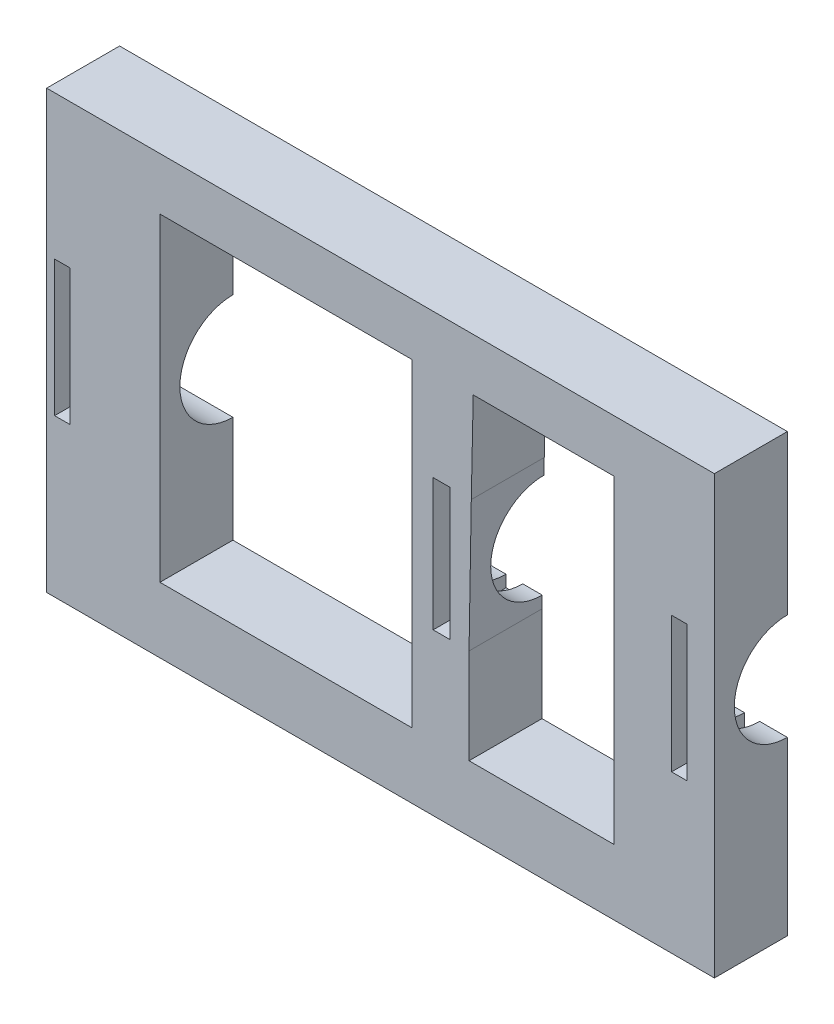
ISO-10303-21;
HEADER;
FILE_DESCRIPTION(('STEP AP214'),'2;1');
FILE_NAME('part.step','',(''),(''),'','','');
FILE_SCHEMA(('AUTOMOTIVE_DESIGN { 1 0 10303 214 1 1 1 1 }'));
ENDSEC;
DATA;
#1=APPLICATION_CONTEXT('core data for automotive mechanical design processes');
#2=APPLICATION_PROTOCOL_DEFINITION('international standard','automotive_design',2000,#1);
#3=PRODUCT_CONTEXT('',#1,'mechanical');
#4=PRODUCT('Part','Part','',(#3));
#5=PRODUCT_RELATED_PRODUCT_CATEGORY('part','',(#4));
#6=PRODUCT_DEFINITION_FORMATION('','',#4);
#7=PRODUCT_DEFINITION_CONTEXT('part definition',#1,'design');
#8=PRODUCT_DEFINITION('design','',#6,#7);
#9=PRODUCT_DEFINITION_SHAPE('','',#8);
#10=(LENGTH_UNIT() NAMED_UNIT(*) SI_UNIT(.MILLI.,.METRE.));
#11=(NAMED_UNIT(*) PLANE_ANGLE_UNIT() SI_UNIT($,.RADIAN.));
#12=(NAMED_UNIT(*) SI_UNIT($,.STERADIAN.) SOLID_ANGLE_UNIT());
#13=UNCERTAINTY_MEASURE_WITH_UNIT(LENGTH_MEASURE(1.E-05),#10,'distance_accuracy_value','');
#14=(GEOMETRIC_REPRESENTATION_CONTEXT(3) GLOBAL_UNCERTAINTY_ASSIGNED_CONTEXT((#13)) GLOBAL_UNIT_ASSIGNED_CONTEXT((#10,
#11,#12)) REPRESENTATION_CONTEXT('',''));
#15=CARTESIAN_POINT('',(0.,0.,0.));
#16=DIRECTION('',(0.,0.,1.));
#17=DIRECTION('',(1.,0.,0.));
#18=AXIS2_PLACEMENT_3D('',#15,#16,#17);
#19=CARTESIAN_POINT('',(0.,22.0472,0.));
#20=DIRECTION('',(0.,1.,0.));
#21=DIRECTION('',(0.,0.,1.));
#22=AXIS2_PLACEMENT_3D('',#19,#20,#21);
#23=PLANE('',#22);
#24=DIRECTION('',(1.,0.,0.));
#25=VECTOR('',#24,1.);
#26=CARTESIAN_POINT('',(0.,22.0472,-10.0297121690447));
#27=LINE('',#26,#25);
#28=CARTESIAN_POINT('',(10.9894216317088,22.0472,-10.0297121690447));
#29=VERTEX_POINT('',#28);
#30=CARTESIAN_POINT('',(35.4588719569476,22.0472,-10.0297121690446));
#31=VERTEX_POINT('',#30);
#32=EDGE_CURVE('E472',#29,#31,#27,.T.);
#33=ORIENTED_EDGE('',*,*,#32,.F.);
#34=DIRECTION('',(0.,0.,-1.));
#35=VECTOR('',#34,1.);
#36=CARTESIAN_POINT('',(10.9894216317088,22.0472,0.));
#37=LINE('',#36,#35);
#38=CARTESIAN_POINT('',(10.9894216317088,22.0472,-17.1069));
#39=VERTEX_POINT('',#38);
#40=EDGE_CURVE('E554',#29,#39,#37,.T.);
#41=ORIENTED_EDGE('',*,*,#40,.T.);
#42=DIRECTION('',(-1.,0.,0.));
#43=VECTOR('',#42,1.);
#44=CARTESIAN_POINT('',(66.04,22.0472,-17.1069));
#45=LINE('',#44,#43);
#46=CARTESIAN_POINT('',(35.4588719569476,22.0472,-17.1069));
#47=VERTEX_POINT('',#46);
#48=EDGE_CURVE('E538',#47,#39,#45,.T.);
#49=ORIENTED_EDGE('',*,*,#48,.F.);
#50=DIRECTION('',(0.,0.,-1.));
#51=VECTOR('',#50,1.);
#52=CARTESIAN_POINT('',(35.4588719569476,22.0472,1.9431));
#53=LINE('',#52,#51);
#54=EDGE_CURVE('E374',#31,#47,#53,.T.);
#55=ORIENTED_EDGE('',*,*,#54,.F.);
#56=EDGE_LOOP('',(#33,#41,#49,#55));
#57=FACE_BOUND('',#56,.T.);
#58=ADVANCED_FACE('F37',(#57),#23,.F.);
#59=CARTESIAN_POINT('',(0.,-8.89,0.));
#60=DIRECTION('',(0.,-1.,0.));
#61=DIRECTION('',(0.,0.,-1.));
#62=AXIS2_PLACEMENT_3D('',#59,#60,#61);
#63=PLANE('',#62);
#64=DIRECTION('',(-1.,0.,0.));
#65=VECTOR('',#64,1.);
#66=CARTESIAN_POINT('',(0.,-8.89,-10.0297121690447));
#67=LINE('',#66,#65);
#68=CARTESIAN_POINT('',(35.4588719569476,-8.89,-10.0297121690447));
#69=VERTEX_POINT('',#68);
#70=CARTESIAN_POINT('',(10.9894216317088,-8.89,-10.0297121690447));
#71=VERTEX_POINT('',#70);
#72=EDGE_CURVE('E475',#69,#71,#67,.T.);
#73=ORIENTED_EDGE('',*,*,#72,.F.);
#74=DIRECTION('',(0.,0.,-1.));
#75=VECTOR('',#74,1.);
#76=CARTESIAN_POINT('',(35.4588719569476,-8.89,0.));
#77=LINE('',#76,#75);
#78=CARTESIAN_POINT('',(35.4588719569476,-8.89,-17.1069));
#79=VERTEX_POINT('',#78);
#80=EDGE_CURVE('E528',#69,#79,#77,.T.);
#81=ORIENTED_EDGE('',*,*,#80,.T.);
#82=DIRECTION('',(1.,0.,0.));
#83=VECTOR('',#82,1.);
#84=CARTESIAN_POINT('',(66.04,-8.89,-17.1069));
#85=LINE('',#84,#83);
#86=CARTESIAN_POINT('',(10.9894216317088,-8.89,-17.1069));
#87=VERTEX_POINT('',#86);
#88=EDGE_CURVE('E349',#87,#79,#85,.T.);
#89=ORIENTED_EDGE('',*,*,#88,.F.);
#90=DIRECTION('',(0.,0.,1.));
#91=VECTOR('',#90,1.);
#92=CARTESIAN_POINT('',(10.9894216317088,-8.89,0.));
#93=LINE('',#92,#91);
#94=EDGE_CURVE('E326',#87,#71,#93,.T.);
#95=ORIENTED_EDGE('',*,*,#94,.T.);
#96=EDGE_LOOP('',(#73,#81,#89,#95));
#97=FACE_BOUND('',#96,.T.);
#98=ADVANCED_FACE('F550',(#97),#63,.F.);
#99=CARTESIAN_POINT('',(62.0901605244133,13.1572,-3.21005743926288));
#100=DIRECTION('',(1.,0.,0.));
#101=DIRECTION('',(0.,0.,-1.));
#102=AXIS2_PLACEMENT_3D('',#99,#100,#101);
#103=PLANE('',#102);
#104=DIRECTION('',(0.,-1.,0.));
#105=VECTOR('',#104,1.);
#106=CARTESIAN_POINT('',(62.0901605244133,13.1572,-10.0297121690447));
#107=LINE('',#106,#105);
#108=CARTESIAN_POINT('',(62.0901605244133,13.1572,-10.0297121690447));
#109=VERTEX_POINT('',#108);
#110=CARTESIAN_POINT('',(62.0901605244133,0.,-10.0297121690447));
#111=VERTEX_POINT('',#110);
#112=EDGE_CURVE('E47',#109,#111,#107,.T.);
#113=ORIENTED_EDGE('',*,*,#112,.F.);
#114=DIRECTION('',(0.,0.,1.));
#115=VECTOR('',#114,1.);
#116=CARTESIAN_POINT('',(62.0901605244133,13.1572,-3.21005743926288));
#117=LINE('',#116,#115);
#118=CARTESIAN_POINT('',(62.0901605244133,13.1572,-17.1069));
#119=VERTEX_POINT('',#118);
#120=EDGE_CURVE('E305',#119,#109,#117,.T.);
#121=ORIENTED_EDGE('',*,*,#120,.F.);
#122=DIRECTION('',(0.,-1.,0.));
#123=VECTOR('',#122,1.);
#124=CARTESIAN_POINT('',(62.0901605244133,13.1572,-17.1069));
#125=LINE('',#124,#123);
#126=CARTESIAN_POINT('',(62.0901605244133,11.7221,-17.1069));
#127=VERTEX_POINT('',#126);
#128=EDGE_CURVE('E343',#119,#127,#125,.T.);
#129=ORIENTED_EDGE('',*,*,#128,.T.);
#130=CARTESIAN_POINT('',(62.0901605244133,6.5786,-17.1069));
#131=DIRECTION('',(1.,0.,0.));
#132=DIRECTION('',(0.,0.,-1.));
#133=AXIS2_PLACEMENT_3D('',#130,#131,#132);
#134=CIRCLE('',#133,5.1435);
#135=CARTESIAN_POINT('',(62.0901605244133,1.4351,-17.1069));
#136=VERTEX_POINT('',#135);
#137=EDGE_CURVE('E339',#127,#136,#134,.T.);
#138=ORIENTED_EDGE('',*,*,#137,.T.);
#139=CARTESIAN_POINT('',(62.0901605244133,0.,-17.1069));
#140=VERTEX_POINT('',#139);
#141=EDGE_CURVE('E342',#136,#140,#125,.T.);
#142=ORIENTED_EDGE('',*,*,#141,.T.);
#143=DIRECTION('',(0.,0.,1.));
#144=VECTOR('',#143,1.);
#145=CARTESIAN_POINT('',(62.0901605244133,0.,-3.21005743926288));
#146=LINE('',#145,#144);
#147=EDGE_CURVE('E609',#140,#111,#146,.T.);
#148=ORIENTED_EDGE('',*,*,#147,.T.);
#149=EDGE_LOOP('',(#113,#121,#129,#138,#142,#148));
#150=FACE_BOUND('',#149,.T.);
#151=ADVANCED_FACE('F652',(#150),#103,.F.);
#152=CARTESIAN_POINT('',(60.6169605244134,13.1572,-3.21005743926288));
#153=DIRECTION('',(-1.,0.,0.));
#154=DIRECTION('',(0.,0.,1.));
#155=AXIS2_PLACEMENT_3D('',#152,#153,#154);
#156=PLANE('',#155);
#157=DIRECTION('',(0.,1.,0.));
#158=VECTOR('',#157,1.);
#159=CARTESIAN_POINT('',(60.6169605244134,13.1572,-10.0297121690447));
#160=LINE('',#159,#158);
#161=CARTESIAN_POINT('',(60.6169605244134,0.,-10.0297121690447));
#162=VERTEX_POINT('',#161);
#163=CARTESIAN_POINT('',(60.6169605244134,13.1572,-10.0297121690447));
#164=VERTEX_POINT('',#163);
#165=EDGE_CURVE('E11',#162,#164,#160,.T.);
#166=ORIENTED_EDGE('',*,*,#165,.F.);
#167=DIRECTION('',(0.,0.,-1.));
#168=VECTOR('',#167,1.);
#169=CARTESIAN_POINT('',(60.6169605244134,0.,-3.21005743926288));
#170=LINE('',#169,#168);
#171=CARTESIAN_POINT('',(60.6169605244134,0.,-17.1069));
#172=VERTEX_POINT('',#171);
#173=EDGE_CURVE('E331',#162,#172,#170,.T.);
#174=ORIENTED_EDGE('',*,*,#173,.T.);
#175=DIRECTION('',(0.,-1.,0.));
#176=VECTOR('',#175,1.);
#177=CARTESIAN_POINT('',(60.6169605244134,13.1572,-17.1069));
#178=LINE('',#177,#176);
#179=CARTESIAN_POINT('',(60.6169605244134,1.4351,-17.1069));
#180=VERTEX_POINT('',#179);
#181=EDGE_CURVE('E518',#180,#172,#178,.T.);
#182=ORIENTED_EDGE('',*,*,#181,.F.);
#183=CARTESIAN_POINT('',(60.6169605244134,6.5786,-17.1069));
#184=DIRECTION('',(-1.,0.,0.));
#185=DIRECTION('',(0.,0.,1.));
#186=AXIS2_PLACEMENT_3D('',#183,#184,#185);
#187=CIRCLE('',#186,5.1435);
#188=CARTESIAN_POINT('',(60.6169605244134,11.7221,-17.1069));
#189=VERTEX_POINT('',#188);
#190=EDGE_CURVE('E328',#180,#189,#187,.T.);
#191=ORIENTED_EDGE('',*,*,#190,.T.);
#192=CARTESIAN_POINT('',(60.6169605244134,13.1572,-17.1069));
#193=VERTEX_POINT('',#192);
#194=EDGE_CURVE('E533',#193,#189,#178,.T.);
#195=ORIENTED_EDGE('',*,*,#194,.F.);
#196=DIRECTION('',(0.,0.,-1.));
#197=VECTOR('',#196,1.);
#198=CARTESIAN_POINT('',(60.6169605244134,13.1572,-3.21005743926288));
#199=LINE('',#198,#197);
#200=EDGE_CURVE('E302',#164,#193,#199,.T.);
#201=ORIENTED_EDGE('',*,*,#200,.F.);
#202=EDGE_LOOP('',(#166,#174,#182,#191,#195,#201));
#203=FACE_BOUND('',#202,.T.);
#204=ADVANCED_FACE('F646',(#203),#156,.F.);
#205=CARTESIAN_POINT('',(55.0505783682912,13.1572,-3.21005743926288));
#206=DIRECTION('',(1.,0.,0.));
#207=DIRECTION('',(0.,0.,-1.));
#208=AXIS2_PLACEMENT_3D('',#205,#206,#207);
#209=PLANE('',#208);
#210=DIRECTION('',(0.,-1.,0.));
#211=VECTOR('',#210,1.);
#212=CARTESIAN_POINT('',(55.0505783682912,13.1572,-10.0297121690447));
#213=LINE('',#212,#211);
#214=CARTESIAN_POINT('',(55.0505783682912,22.0472,-10.0297121690447));
#215=VERTEX_POINT('',#214);
#216=CARTESIAN_POINT('',(55.0505783682912,-8.89,-10.0297121690447));
#217=VERTEX_POINT('',#216);
#218=EDGE_CURVE('E482',#215,#217,#213,.T.);
#219=ORIENTED_EDGE('',*,*,#218,.F.);
#220=DIRECTION('',(0.,0.,1.));
#221=VECTOR('',#220,1.);
#222=CARTESIAN_POINT('',(55.0505783682912,22.0472,-17.1069));
#223=LINE('',#222,#221);
#224=CARTESIAN_POINT('',(55.0505783682912,22.0472,-17.1069));
#225=VERTEX_POINT('',#224);
#226=EDGE_CURVE('E509',#225,#215,#223,.T.);
#227=ORIENTED_EDGE('',*,*,#226,.F.);
#228=DIRECTION('',(0.,-1.,0.));
#229=VECTOR('',#228,1.);
#230=CARTESIAN_POINT('',(55.0505783682912,13.1572,-17.1069));
#231=LINE('',#230,#229);
#232=CARTESIAN_POINT('',(55.0505783682912,11.7221,-17.1069));
#233=VERTEX_POINT('',#232);
#234=EDGE_CURVE('E323',#225,#233,#231,.T.);
#235=ORIENTED_EDGE('',*,*,#234,.T.);
#236=CARTESIAN_POINT('',(55.0505783682912,6.5786,-17.1069));
#237=DIRECTION('',(1.,0.,0.));
#238=DIRECTION('',(0.,0.,-1.));
#239=AXIS2_PLACEMENT_3D('',#236,#237,#238);
#240=CIRCLE('',#239,5.1435);
#241=CARTESIAN_POINT('',(55.0505783682912,1.4351,-17.1069));
#242=VERTEX_POINT('',#241);
#243=EDGE_CURVE('E321',#233,#242,#240,.T.);
#244=ORIENTED_EDGE('',*,*,#243,.T.);
#245=CARTESIAN_POINT('',(55.0505783682912,-8.89,-17.1069));
#246=VERTEX_POINT('',#245);
#247=EDGE_CURVE('E314',#242,#246,#231,.T.);
#248=ORIENTED_EDGE('',*,*,#247,.T.);
#249=DIRECTION('',(0.,0.,-1.));
#250=VECTOR('',#249,1.);
#251=CARTESIAN_POINT('',(55.0505783682912,-8.89,-17.1069));
#252=LINE('',#251,#250);
#253=EDGE_CURVE('E460',#217,#246,#252,.T.);
#254=ORIENTED_EDGE('',*,*,#253,.F.);
#255=EDGE_LOOP('',(#219,#227,#235,#244,#248,#254));
#256=FACE_BOUND('',#255,.T.);
#257=ADVANCED_FACE('F641',(#256),#209,.F.);
#258=CARTESIAN_POINT('',(10.9894216317088,13.1572,-17.1069));
#259=DIRECTION('',(-1.,0.,0.));
#260=DIRECTION('',(0.,0.,1.));
#261=AXIS2_PLACEMENT_3D('',#258,#259,#260);
#262=PLANE('',#261);
#263=DIRECTION('',(0.,1.,0.));
#264=VECTOR('',#263,1.);
#265=CARTESIAN_POINT('',(10.9894216317088,13.1572,-10.0297121690447));
#266=LINE('',#265,#264);
#267=EDGE_CURVE('E420',#71,#29,#266,.T.);
#268=ORIENTED_EDGE('',*,*,#267,.F.);
#269=ORIENTED_EDGE('',*,*,#94,.F.);
#270=DIRECTION('',(0.,-1.,0.));
#271=VECTOR('',#270,1.);
#272=CARTESIAN_POINT('',(10.9894216317088,13.1572,-17.1069));
#273=LINE('',#272,#271);
#274=CARTESIAN_POINT('',(10.9894216317088,1.4351,-17.1069));
#275=VERTEX_POINT('',#274);
#276=EDGE_CURVE('E353',#275,#87,#273,.T.);
#277=ORIENTED_EDGE('',*,*,#276,.F.);
#278=CARTESIAN_POINT('',(10.9894216317088,6.5786,-17.1069));
#279=DIRECTION('',(-1.,0.,0.));
#280=DIRECTION('',(0.,0.,1.));
#281=AXIS2_PLACEMENT_3D('',#278,#279,#280);
#282=CIRCLE('',#281,5.1435);
#283=CARTESIAN_POINT('',(10.9894216317088,11.7221,-17.1069));
#284=VERTEX_POINT('',#283);
#285=EDGE_CURVE('E310',#275,#284,#282,.T.);
#286=ORIENTED_EDGE('',*,*,#285,.T.);
#287=EDGE_CURVE('E536',#39,#284,#273,.T.);
#288=ORIENTED_EDGE('',*,*,#287,.F.);
#289=ORIENTED_EDGE('',*,*,#40,.F.);
#290=EDGE_LOOP('',(#268,#269,#277,#286,#288,#289));
#291=FACE_BOUND('',#290,.T.);
#292=ADVANCED_FACE('F546',(#291),#262,.F.);
#293=CARTESIAN_POINT('',(0.,13.1572,-17.1069));
#294=DIRECTION('',(1.,0.,0.));
#295=DIRECTION('',(0.,0.,-1.));
#296=AXIS2_PLACEMENT_3D('',#293,#294,#295);
#297=PLANE('',#296);
#298=DIRECTION('',(0.,-1.,0.));
#299=VECTOR('',#298,1.);
#300=CARTESIAN_POINT('',(0.,27.1272,-10.0297121690447));
#301=LINE('',#300,#299);
#302=CARTESIAN_POINT('',(0.,27.1272,-10.0297121690447));
#303=VERTEX_POINT('',#302);
#304=CARTESIAN_POINT('',(0.,-15.24,-10.0297121690447));
#305=VERTEX_POINT('',#304);
#306=EDGE_CURVE('E41',#303,#305,#301,.T.);
#307=ORIENTED_EDGE('',*,*,#306,.F.);
#308=DIRECTION('',(0.,0.,1.));
#309=VECTOR('',#308,1.);
#310=CARTESIAN_POINT('',(0.,27.1272,-17.1069));
#311=LINE('',#310,#309);
#312=CARTESIAN_POINT('',(0.,27.1272,-17.1069));
#313=VERTEX_POINT('',#312);
#314=EDGE_CURVE('E506',#313,#303,#311,.T.);
#315=ORIENTED_EDGE('',*,*,#314,.F.);
#316=DIRECTION('',(0.,-1.,0.));
#317=VECTOR('',#316,1.);
#318=CARTESIAN_POINT('',(0.,13.1572,-17.1069));
#319=LINE('',#318,#317);
#320=CARTESIAN_POINT('',(0.,11.7221,-17.1069));
#321=VERTEX_POINT('',#320);
#322=EDGE_CURVE('E304',#313,#321,#319,.T.);
#323=ORIENTED_EDGE('',*,*,#322,.T.);
#324=CARTESIAN_POINT('',(0.,6.5786,-17.1069));
#325=DIRECTION('',(1.,0.,0.));
#326=DIRECTION('',(0.,0.,-1.));
#327=AXIS2_PLACEMENT_3D('',#324,#325,#326);
#328=CIRCLE('',#327,5.1435);
#329=CARTESIAN_POINT('',(0.,1.4351,-17.1069));
#330=VERTEX_POINT('',#329);
#331=EDGE_CURVE('E301',#321,#330,#328,.T.);
#332=ORIENTED_EDGE('',*,*,#331,.T.);
#333=CARTESIAN_POINT('',(0.,-15.24,-17.1069));
#334=VERTEX_POINT('',#333);
#335=EDGE_CURVE('E292',#330,#334,#319,.T.);
#336=ORIENTED_EDGE('',*,*,#335,.T.);
#337=DIRECTION('',(0.,0.,-1.));
#338=VECTOR('',#337,1.);
#339=CARTESIAN_POINT('',(0.,-15.24,3.17828783095535));
#340=LINE('',#339,#338);
#341=EDGE_CURVE('E276',#305,#334,#340,.T.);
#342=ORIENTED_EDGE('',*,*,#341,.F.);
#343=EDGE_LOOP('',(#307,#315,#323,#332,#336,#342));
#344=FACE_BOUND('',#343,.T.);
#345=ADVANCED_FACE('F298',(#344),#297,.F.);
#346=CARTESIAN_POINT('',(0.,13.1572,0.));
#347=DIRECTION('',(0.,1.,0.));
#348=DIRECTION('',(0.,0.,1.));
#349=AXIS2_PLACEMENT_3D('',#346,#347,#348);
#350=PLANE('',#349);
#351=DIRECTION('',(1.,0.,0.));
#352=VECTOR('',#351,1.);
#353=CARTESIAN_POINT('',(0.,13.1572,-10.0297121690447));
#354=LINE('',#353,#352);
#355=EDGE_CURVE('E452',#164,#109,#354,.T.);
#356=ORIENTED_EDGE('',*,*,#355,.F.);
#357=ORIENTED_EDGE('',*,*,#200,.T.);
#358=DIRECTION('',(-1.,0.,0.));
#359=VECTOR('',#358,1.);
#360=CARTESIAN_POINT('',(66.04,13.1572,-17.1069));
#361=LINE('',#360,#359);
#362=EDGE_CURVE('E336',#119,#193,#361,.T.);
#363=ORIENTED_EDGE('',*,*,#362,.F.);
#364=ORIENTED_EDGE('',*,*,#120,.T.);
#365=EDGE_LOOP('',(#356,#357,#363,#364));
#366=FACE_BOUND('',#365,.T.);
#367=ADVANCED_FACE('F651',(#366),#350,.F.);
#368=DIRECTION('',(1.,0.,0.));
#369=VECTOR('',#368,1.);
#370=CARTESIAN_POINT('',(0.,22.0472,-10.0297121690447));
#371=LINE('',#370,#369);
#372=CARTESIAN_POINT('',(41.3758963344435,22.0472,-10.0297121690447));
#373=VERTEX_POINT('',#372);
#374=EDGE_CURVE('E480',#373,#215,#371,.T.);
#375=ORIENTED_EDGE('',*,*,#374,.F.);
#376=DIRECTION('',(0.,0.,-1.));
#377=VECTOR('',#376,1.);
#378=CARTESIAN_POINT('',(41.3758963344435,22.0472,0.));
#379=LINE('',#378,#377);
#380=CARTESIAN_POINT('',(41.3758963344435,22.0472,-17.1069));
#381=VERTEX_POINT('',#380);
#382=EDGE_CURVE('E513',#373,#381,#379,.T.);
#383=ORIENTED_EDGE('',*,*,#382,.T.);
#384=EDGE_CURVE('E391',#225,#381,#45,.T.);
#385=ORIENTED_EDGE('',*,*,#384,.F.);
#386=ORIENTED_EDGE('',*,*,#226,.T.);
#387=EDGE_LOOP('',(#375,#383,#385,#386));
#388=FACE_BOUND('',#387,.T.);
#389=ADVANCED_FACE('F635',(#388),#23,.F.);
#390=CARTESIAN_POINT('',(0.,27.1272,0.));
#391=DIRECTION('',(0.,1.,0.));
#392=DIRECTION('',(0.,0.,1.));
#393=AXIS2_PLACEMENT_3D('',#390,#391,#392);
#394=PLANE('',#393);
#395=ORIENTED_EDGE('',*,*,#314,.T.);
#396=DIRECTION('',(-1.,0.,0.));
#397=VECTOR('',#396,1.);
#398=CARTESIAN_POINT('',(0.,27.1272,-10.0297121690447));
#399=LINE('',#398,#397);
#400=CARTESIAN_POINT('',(64.77,27.1272,-10.0297121690447));
#401=VERTEX_POINT('',#400);
#402=EDGE_CURVE('E483',#401,#303,#399,.T.);
#403=ORIENTED_EDGE('',*,*,#402,.F.);
#404=DIRECTION('',(0.,0.,1.));
#405=VECTOR('',#404,1.);
#406=CARTESIAN_POINT('',(64.77,27.1272,-17.1069));
#407=LINE('',#406,#405);
#408=CARTESIAN_POINT('',(64.77,27.1272,-17.1069));
#409=VERTEX_POINT('',#408);
#410=EDGE_CURVE('E427',#409,#401,#407,.T.);
#411=ORIENTED_EDGE('',*,*,#410,.F.);
#412=DIRECTION('',(-1.,0.,0.));
#413=VECTOR('',#412,1.);
#414=CARTESIAN_POINT('',(66.04,27.1272,-17.1069));
#415=LINE('',#414,#413);
#416=EDGE_CURVE('E461',#409,#313,#415,.T.);
#417=ORIENTED_EDGE('',*,*,#416,.T.);
#418=EDGE_LOOP('',(#395,#403,#411,#417));
#419=FACE_BOUND('',#418,.T.);
#420=ADVANCED_FACE('F507',(#419),#394,.T.);
#421=CARTESIAN_POINT('',(0.,0.,0.));
#422=DIRECTION('',(0.,1.,0.));
#423=DIRECTION('',(0.,0.,1.));
#424=AXIS2_PLACEMENT_3D('',#421,#422,#423);
#425=PLANE('',#424);
#426=ORIENTED_EDGE('',*,*,#173,.F.);
#427=DIRECTION('',(1.,0.,0.));
#428=VECTOR('',#427,1.);
#429=CARTESIAN_POINT('',(0.,0.,-10.0297121690447));
#430=LINE('',#429,#428);
#431=EDGE_CURVE('E457',#162,#111,#430,.T.);
#432=ORIENTED_EDGE('',*,*,#431,.T.);
#433=ORIENTED_EDGE('',*,*,#147,.F.);
#434=DIRECTION('',(1.,0.,0.));
#435=VECTOR('',#434,1.);
#436=CARTESIAN_POINT('',(66.04,0.,-17.1069));
#437=LINE('',#436,#435);
#438=EDGE_CURVE('E347',#172,#140,#437,.T.);
#439=ORIENTED_EDGE('',*,*,#438,.F.);
#440=EDGE_LOOP('',(#426,#432,#433,#439));
#441=FACE_BOUND('',#440,.T.);
#442=ADVANCED_FACE('F607',(#441),#425,.T.);
#443=DIRECTION('',(-1.,0.,0.));
#444=VECTOR('',#443,1.);
#445=CARTESIAN_POINT('',(0.,-8.89,-10.0297121690447));
#446=LINE('',#445,#444);
#447=CARTESIAN_POINT('',(40.9712498169064,-8.89,-10.0297121690447));
#448=VERTEX_POINT('',#447);
#449=EDGE_CURVE('E454',#217,#448,#446,.T.);
#450=ORIENTED_EDGE('',*,*,#449,.F.);
#451=ORIENTED_EDGE('',*,*,#253,.T.);
#452=CARTESIAN_POINT('',(40.9712498169064,-8.89,-17.1069));
#453=VERTEX_POINT('',#452);
#454=EDGE_CURVE('E354',#453,#246,#85,.T.);
#455=ORIENTED_EDGE('',*,*,#454,.F.);
#456=DIRECTION('',(0.,0.,1.));
#457=VECTOR('',#456,1.);
#458=CARTESIAN_POINT('',(40.9712498169064,-8.89,0.));
#459=LINE('',#458,#457);
#460=EDGE_CURVE('E464',#453,#448,#459,.T.);
#461=ORIENTED_EDGE('',*,*,#460,.T.);
#462=EDGE_LOOP('',(#450,#451,#455,#461));
#463=FACE_BOUND('',#462,.T.);
#464=ADVANCED_FACE('F596',(#463),#63,.F.);
#465=CARTESIAN_POINT('',(0.,0.365369571658807,1.9431));
#466=DIRECTION('',(0.,1.,0.));
#467=DIRECTION('',(0.,0.,1.));
#468=AXIS2_PLACEMENT_3D('',#465,#466,#467);
#469=PLANE('',#468);
#470=DIRECTION('',(0.,0.,-1.));
#471=VECTOR('',#470,1.);
#472=CARTESIAN_POINT('',(37.4908719569476,0.365369571658807,1.9431));
#473=LINE('',#472,#471);
#474=CARTESIAN_POINT('',(37.4908719569476,0.365369571658807,-10.0297121690447));
#475=VERTEX_POINT('',#474);
#476=CARTESIAN_POINT('',(37.4908719569476,0.365369571658807,-17.1069));
#477=VERTEX_POINT('',#476);
#478=EDGE_CURVE('E355',#475,#477,#473,.T.);
#479=ORIENTED_EDGE('',*,*,#478,.F.);
#480=DIRECTION('',(1.,0.,0.));
#481=VECTOR('',#480,1.);
#482=CARTESIAN_POINT('',(0.,0.365369571658807,-10.0297121690447));
#483=LINE('',#482,#481);
#484=CARTESIAN_POINT('',(39.106263289872,0.365369571658807,-10.0297121690447));
#485=VERTEX_POINT('',#484);
#486=EDGE_CURVE('E362',#475,#485,#483,.T.);
#487=ORIENTED_EDGE('',*,*,#486,.T.);
#488=DIRECTION('',(0.,0.,-1.));
#489=VECTOR('',#488,1.);
#490=CARTESIAN_POINT('',(39.106263289872,0.365369571658807,1.9431));
#491=LINE('',#490,#489);
#492=CARTESIAN_POINT('',(39.106263289872,0.365369571658807,-17.1069));
#493=VERTEX_POINT('',#492);
#494=EDGE_CURVE('E359',#485,#493,#491,.T.);
#495=ORIENTED_EDGE('',*,*,#494,.T.);
#496=DIRECTION('',(1.,0.,0.));
#497=VECTOR('',#496,1.);
#498=CARTESIAN_POINT('',(0.,0.365369571658807,-17.1069));
#499=LINE('',#498,#497);
#500=EDGE_CURVE('E401',#477,#493,#499,.T.);
#501=ORIENTED_EDGE('',*,*,#500,.F.);
#502=EDGE_LOOP('',(#479,#487,#495,#501));
#503=FACE_BOUND('',#502,.T.);
#504=ADVANCED_FACE('F571',(#503),#469,.T.);
#505=CARTESIAN_POINT('',(40.9537664668092,-0.695619484047465,1.9431));
#506=DIRECTION('',(0.999855777897971,-0.0169830328281757,0.));
#507=DIRECTION('',(0.0169830328281757,0.999855777897971,0.));
#508=AXIS2_PLACEMENT_3D('',#505,#506,#507);
#509=PLANE('',#508);
#510=DIRECTION('',(0.,0.,-1.));
#511=VECTOR('',#510,1.);
#512=CARTESIAN_POINT('',(41.189063289872,13.1572,1.9431));
#513=LINE('',#512,#511);
#514=CARTESIAN_POINT('',(41.189063289872,13.1572,-10.0297121690447));
#515=VERTEX_POINT('',#514);
#516=CARTESIAN_POINT('',(41.189063289872,13.1572,-17.1069));
#517=VERTEX_POINT('',#516);
#518=EDGE_CURVE('E369',#515,#517,#513,.T.);
#519=ORIENTED_EDGE('',*,*,#518,.F.);
#520=DIRECTION('',(-0.0169830328281757,-0.999855777897971,0.));
#521=VECTOR('',#520,1.);
#522=CARTESIAN_POINT('',(40.9537664668092,-0.695619484047465,-10.0297121690447));
#523=LINE('',#522,#521);
#524=CARTESIAN_POINT('',(40.9712498169064,0.333691875622167,-10.0297121690447));
#525=VERTEX_POINT('',#524);
#526=EDGE_CURVE('E361',#515,#525,#523,.T.);
#527=ORIENTED_EDGE('',*,*,#526,.T.);
#528=DIRECTION('',(0.,0.,-1.));
#529=VECTOR('',#528,1.);
#530=CARTESIAN_POINT('',(40.9712498169064,0.333691875622167,1.9431));
#531=LINE('',#530,#529);
#532=CARTESIAN_POINT('',(40.9712498169064,0.333691875622167,-17.1069));
#533=VERTEX_POINT('',#532);
#534=EDGE_CURVE('E372',#525,#533,#531,.T.);
#535=ORIENTED_EDGE('',*,*,#534,.T.);
#536=DIRECTION('',(-0.0169830328281757,-0.999855777897971,0.));
#537=VECTOR('',#536,1.);
#538=CARTESIAN_POINT('',(40.9537664668092,-0.695619484047465,-17.1069));
#539=LINE('',#538,#537);
#540=CARTESIAN_POINT('',(40.9910363434789,1.4986,-17.1069));
#541=VERTEX_POINT('',#540);
#542=EDGE_CURVE('E383',#541,#533,#539,.T.);
#543=ORIENTED_EDGE('',*,*,#542,.F.);
#544=CARTESIAN_POINT('',(41.0773225946306,6.5786,-17.1069));
#545=DIRECTION('',(0.999855777897971,-0.0169830328281757,0.));
#546=DIRECTION('',(-0.0169830328281757,-0.999855777897971,0.));
#547=AXIS2_PLACEMENT_3D('',#544,#545,#546);
#548=ELLIPSE('',#547,5.08073275395762,5.08);
#549=CARTESIAN_POINT('',(41.1636088457822,11.6586,-17.1069));
#550=VERTEX_POINT('',#549);
#551=EDGE_CURVE('E412',#550,#541,#548,.T.);
#552=ORIENTED_EDGE('',*,*,#551,.F.);
#553=EDGE_CURVE('E384',#517,#550,#539,.T.);
#554=ORIENTED_EDGE('',*,*,#553,.F.);
#555=EDGE_LOOP('',(#519,#527,#535,#543,#552,#554));
#556=FACE_BOUND('',#555,.T.);
#557=ADVANCED_FACE('F591',(#556),#509,.T.);
#558=CARTESIAN_POINT('',(37.4908719569476,0.,1.9431));
#559=DIRECTION('',(1.,0.,0.));
#560=DIRECTION('',(0.,0.,-1.));
#561=AXIS2_PLACEMENT_3D('',#558,#559,#560);
#562=PLANE('',#561);
#563=DIRECTION('',(0.,0.,-1.));
#564=VECTOR('',#563,1.);
#565=CARTESIAN_POINT('',(37.4908719569476,13.1572,1.9431));
#566=LINE('',#565,#564);
#567=CARTESIAN_POINT('',(37.4908719569476,13.1572,-10.0297121690446));
#568=VERTEX_POINT('',#567);
#569=CARTESIAN_POINT('',(37.4908719569476,13.1572,-17.1069));
#570=VERTEX_POINT('',#569);
#571=EDGE_CURVE('E366',#568,#570,#566,.T.);
#572=ORIENTED_EDGE('',*,*,#571,.F.);
#573=DIRECTION('',(0.,-1.,0.));
#574=VECTOR('',#573,1.);
#575=CARTESIAN_POINT('',(37.4908719569476,0.,-10.0297121690447));
#576=LINE('',#575,#574);
#577=EDGE_CURVE('E358',#568,#475,#576,.T.);
#578=ORIENTED_EDGE('',*,*,#577,.T.);
#579=ORIENTED_EDGE('',*,*,#478,.T.);
#580=DIRECTION('',(0.,-1.,0.));
#581=VECTOR('',#580,1.);
#582=CARTESIAN_POINT('',(37.4908719569476,0.,-17.1069));
#583=LINE('',#582,#581);
#584=CARTESIAN_POINT('',(37.4908719569476,1.4986,-17.1069));
#585=VERTEX_POINT('',#584);
#586=EDGE_CURVE('E404',#585,#477,#583,.T.);
#587=ORIENTED_EDGE('',*,*,#586,.F.);
#588=CARTESIAN_POINT('',(37.4908719569476,6.5786,-17.1069));
#589=DIRECTION('',(1.,0.,0.));
#590=DIRECTION('',(0.,0.,-1.));
#591=AXIS2_PLACEMENT_3D('',#588,#589,#590);
#592=CIRCLE('',#591,5.08);
#593=CARTESIAN_POINT('',(37.4908719569476,11.6586,-17.1069));
#594=VERTEX_POINT('',#593);
#595=EDGE_CURVE('E408',#594,#585,#592,.T.);
#596=ORIENTED_EDGE('',*,*,#595,.F.);
#597=EDGE_CURVE('E395',#570,#594,#583,.T.);
#598=ORIENTED_EDGE('',*,*,#597,.F.);
#599=EDGE_LOOP('',(#572,#578,#579,#587,#596,#598));
#600=FACE_BOUND('',#599,.T.);
#601=ADVANCED_FACE('F566',(#600),#562,.T.);
#602=CARTESIAN_POINT('',(39.106263289872,0.,1.9431));
#603=DIRECTION('',(-1.,0.,0.));
#604=DIRECTION('',(0.,0.,1.));
#605=AXIS2_PLACEMENT_3D('',#602,#603,#604);
#606=PLANE('',#605);
#607=ORIENTED_EDGE('',*,*,#494,.F.);
#608=DIRECTION('',(0.,1.,0.));
#609=VECTOR('',#608,1.);
#610=CARTESIAN_POINT('',(39.106263289872,0.,-10.0297121690447));
#611=LINE('',#610,#609);
#612=CARTESIAN_POINT('',(39.106263289872,13.1572,-10.0297121690447));
#613=VERTEX_POINT('',#612);
#614=EDGE_CURVE('E357',#485,#613,#611,.T.);
#615=ORIENTED_EDGE('',*,*,#614,.T.);
#616=DIRECTION('',(0.,0.,-1.));
#617=VECTOR('',#616,1.);
#618=CARTESIAN_POINT('',(39.106263289872,13.1572,1.9431));
#619=LINE('',#618,#617);
#620=CARTESIAN_POINT('',(39.106263289872,13.1572,-17.1069));
#621=VERTEX_POINT('',#620);
#622=EDGE_CURVE('E363',#613,#621,#619,.T.);
#623=ORIENTED_EDGE('',*,*,#622,.T.);
#624=DIRECTION('',(0.,1.,0.));
#625=VECTOR('',#624,1.);
#626=CARTESIAN_POINT('',(39.106263289872,0.,-17.1069));
#627=LINE('',#626,#625);
#628=CARTESIAN_POINT('',(39.106263289872,11.6586,-17.1069));
#629=VERTEX_POINT('',#628);
#630=EDGE_CURVE('E396',#629,#621,#627,.T.);
#631=ORIENTED_EDGE('',*,*,#630,.F.);
#632=CARTESIAN_POINT('',(39.106263289872,6.5786,-17.1069));
#633=DIRECTION('',(-1.,0.,0.));
#634=DIRECTION('',(0.,0.,1.));
#635=AXIS2_PLACEMENT_3D('',#632,#633,#634);
#636=CIRCLE('',#635,5.08);
#637=CARTESIAN_POINT('',(39.106263289872,1.4986,-17.1069));
#638=VERTEX_POINT('',#637);
#639=EDGE_CURVE('E414',#638,#629,#636,.T.);
#640=ORIENTED_EDGE('',*,*,#639,.F.);
#641=EDGE_CURVE('E397',#493,#638,#627,.T.);
#642=ORIENTED_EDGE('',*,*,#641,.F.);
#643=EDGE_LOOP('',(#607,#615,#623,#631,#640,#642));
#644=FACE_BOUND('',#643,.T.);
#645=ADVANCED_FACE('F578',(#644),#606,.T.);
#646=CARTESIAN_POINT('',(0.,13.1572,1.9431));
#647=DIRECTION('',(0.,-1.,0.));
#648=DIRECTION('',(0.,0.,-1.));
#649=AXIS2_PLACEMENT_3D('',#646,#647,#648);
#650=PLANE('',#649);
#651=ORIENTED_EDGE('',*,*,#622,.F.);
#652=DIRECTION('',(-1.,0.,0.));
#653=VECTOR('',#652,1.);
#654=CARTESIAN_POINT('',(0.,13.1572,-10.0297121690447));
#655=LINE('',#654,#653);
#656=EDGE_CURVE('E365',#613,#568,#655,.T.);
#657=ORIENTED_EDGE('',*,*,#656,.T.);
#658=ORIENTED_EDGE('',*,*,#571,.T.);
#659=DIRECTION('',(-1.,0.,0.));
#660=VECTOR('',#659,1.);
#661=CARTESIAN_POINT('',(0.,13.1572,-17.1069));
#662=LINE('',#661,#660);
#663=EDGE_CURVE('E392',#621,#570,#662,.T.);
#664=ORIENTED_EDGE('',*,*,#663,.F.);
#665=EDGE_LOOP('',(#651,#657,#658,#664));
#666=FACE_BOUND('',#665,.T.);
#667=ADVANCED_FACE('F786',(#666),#650,.T.);
#668=CARTESIAN_POINT('',(40.8944882674512,-0.859442266501925,1.9431));
#669=DIRECTION('',(0.999779235097224,-0.0210114508878062,0.));
#670=DIRECTION('',(0.0210114508878062,0.999779235097224,0.));
#671=AXIS2_PLACEMENT_3D('',#668,#669,#670);
#672=PLANE('',#671);
#673=ORIENTED_EDGE('',*,*,#382,.F.);
#674=DIRECTION('',(-0.0210114508878062,-0.999779235097224,0.));
#675=VECTOR('',#674,1.);
#676=CARTESIAN_POINT('',(40.8944882674512,-0.859442266501925,-10.0297121690447));
#677=LINE('',#676,#675);
#678=EDGE_CURVE('E368',#373,#515,#677,.T.);
#679=ORIENTED_EDGE('',*,*,#678,.T.);
#680=ORIENTED_EDGE('',*,*,#518,.T.);
#681=DIRECTION('',(-0.0210114508878062,-0.999779235097224,0.));
#682=VECTOR('',#681,1.);
#683=CARTESIAN_POINT('',(40.8944882674512,-0.859442266501925,-17.1069));
#684=LINE('',#683,#682);
#685=EDGE_CURVE('E388',#381,#517,#684,.T.);
#686=ORIENTED_EDGE('',*,*,#685,.F.);
#687=EDGE_LOOP('',(#673,#679,#680,#686));
#688=FACE_BOUND('',#687,.T.);
#689=ADVANCED_FACE('F637',(#688),#672,.T.);
#690=CARTESIAN_POINT('',(35.4588719569476,0.,1.9431));
#691=DIRECTION('',(-1.,0.,0.));
#692=DIRECTION('',(0.,0.,1.));
#693=AXIS2_PLACEMENT_3D('',#690,#691,#692);
#694=PLANE('',#693);
#695=ORIENTED_EDGE('',*,*,#80,.F.);
#696=DIRECTION('',(0.,1.,0.));
#697=VECTOR('',#696,1.);
#698=CARTESIAN_POINT('',(35.4588719569476,0.,-10.0297121690447));
#699=LINE('',#698,#697);
#700=EDGE_CURVE('E371',#69,#31,#699,.T.);
#701=ORIENTED_EDGE('',*,*,#700,.T.);
#702=ORIENTED_EDGE('',*,*,#54,.T.);
#703=DIRECTION('',(0.,1.,0.));
#704=VECTOR('',#703,1.);
#705=CARTESIAN_POINT('',(35.4588719569476,0.,-17.1069));
#706=LINE('',#705,#704);
#707=CARTESIAN_POINT('',(35.4588719569476,11.6586,-17.1069));
#708=VERTEX_POINT('',#707);
#709=EDGE_CURVE('E380',#708,#47,#706,.T.);
#710=ORIENTED_EDGE('',*,*,#709,.F.);
#711=CARTESIAN_POINT('',(35.4588719569476,6.5786,-17.1069));
#712=DIRECTION('',(-1.,0.,0.));
#713=DIRECTION('',(0.,0.,1.));
#714=AXIS2_PLACEMENT_3D('',#711,#712,#713);
#715=CIRCLE('',#714,5.08);
#716=CARTESIAN_POINT('',(35.4588719569476,1.4986,-17.1069));
#717=VERTEX_POINT('',#716);
#718=EDGE_CURVE('E410',#717,#708,#715,.T.);
#719=ORIENTED_EDGE('',*,*,#718,.F.);
#720=EDGE_CURVE('E352',#79,#717,#706,.T.);
#721=ORIENTED_EDGE('',*,*,#720,.F.);
#722=EDGE_LOOP('',(#695,#701,#702,#710,#719,#721));
#723=FACE_BOUND('',#722,.T.);
#724=ADVANCED_FACE('F556',(#723),#694,.T.);
#725=CARTESIAN_POINT('',(40.9712498169064,0.,1.9431));
#726=DIRECTION('',(1.,0.,0.));
#727=DIRECTION('',(0.,0.,-1.));
#728=AXIS2_PLACEMENT_3D('',#725,#726,#727);
#729=PLANE('',#728);
#730=ORIENTED_EDGE('',*,*,#534,.F.);
#731=DIRECTION('',(0.,-1.,0.));
#732=VECTOR('',#731,1.);
#733=CARTESIAN_POINT('',(40.9712498169064,0.,-10.0297121690447));
#734=LINE('',#733,#732);
#735=EDGE_CURVE('E376',#525,#448,#734,.T.);
#736=ORIENTED_EDGE('',*,*,#735,.T.);
#737=ORIENTED_EDGE('',*,*,#460,.F.);
#738=DIRECTION('',(0.,-1.,0.));
#739=VECTOR('',#738,1.);
#740=CARTESIAN_POINT('',(40.9712498169064,0.,-17.1069));
#741=LINE('',#740,#739);
#742=EDGE_CURVE('E381',#533,#453,#741,.T.);
#743=ORIENTED_EDGE('',*,*,#742,.F.);
#744=EDGE_LOOP('',(#730,#736,#737,#743));
#745=FACE_BOUND('',#744,.T.);
#746=ADVANCED_FACE('F595',(#745),#729,.T.);
#747=CARTESIAN_POINT('',(64.77,0.,0.));
#748=DIRECTION('',(-1.,0.,0.));
#749=DIRECTION('',(0.,0.,1.));
#750=AXIS2_PLACEMENT_3D('',#747,#748,#749);
#751=PLANE('',#750);
#752=DIRECTION('',(0.,1.,0.));
#753=VECTOR('',#752,1.);
#754=CARTESIAN_POINT('',(64.77,27.1272,-10.0297121690447));
#755=LINE('',#754,#753);
#756=CARTESIAN_POINT('',(64.77,-15.24,-10.0297121690447));
#757=VERTEX_POINT('',#756);
#758=EDGE_CURVE('E117',#757,#401,#755,.T.);
#759=ORIENTED_EDGE('',*,*,#758,.F.);
#760=DIRECTION('',(0.,0.,1.));
#761=VECTOR('',#760,1.);
#762=CARTESIAN_POINT('',(64.77,-15.24,3.17828783095535));
#763=LINE('',#762,#761);
#764=CARTESIAN_POINT('',(64.77,-15.24,-17.1069));
#765=VERTEX_POINT('',#764);
#766=EDGE_CURVE('E295',#765,#757,#763,.T.);
#767=ORIENTED_EDGE('',*,*,#766,.F.);
#768=DIRECTION('',(0.,1.,0.));
#769=VECTOR('',#768,1.);
#770=CARTESIAN_POINT('',(64.77,-34.29,-17.1069));
#771=LINE('',#770,#769);
#772=CARTESIAN_POINT('',(64.77,1.4351,-17.1069));
#773=VERTEX_POINT('',#772);
#774=EDGE_CURVE('E294',#765,#773,#771,.T.);
#775=ORIENTED_EDGE('',*,*,#774,.T.);
#776=CARTESIAN_POINT('',(64.77,6.5786,-17.1069));
#777=DIRECTION('',(-1.,0.,0.));
#778=DIRECTION('',(0.,0.,1.));
#779=AXIS2_PLACEMENT_3D('',#776,#777,#778);
#780=CIRCLE('',#779,5.1435);
#781=CARTESIAN_POINT('',(64.77,11.7221,-17.1069));
#782=VERTEX_POINT('',#781);
#783=EDGE_CURVE('E421',#782,#773,#780,.F.);
#784=ORIENTED_EDGE('',*,*,#783,.F.);
#785=EDGE_CURVE('E426',#782,#409,#771,.T.);
#786=ORIENTED_EDGE('',*,*,#785,.T.);
#787=ORIENTED_EDGE('',*,*,#410,.T.);
#788=EDGE_LOOP('',(#759,#767,#775,#784,#786,#787));
#789=FACE_BOUND('',#788,.T.);
#790=ADVANCED_FACE('F659',(#789),#751,.F.);
#791=CARTESIAN_POINT('',(2.24803947558665,0.,-1.8669));
#792=DIRECTION('',(1.,0.,0.));
#793=DIRECTION('',(0.,0.,-1.));
#794=AXIS2_PLACEMENT_3D('',#791,#792,#793);
#795=PLANE('',#794);
#796=DIRECTION('',(0.,-1.,0.));
#797=VECTOR('',#796,1.);
#798=CARTESIAN_POINT('',(2.24803947558665,0.,-10.0297121690447));
#799=LINE('',#798,#797);
#800=CARTESIAN_POINT('',(2.24803947558665,13.1572,-10.0297121690447));
#801=VERTEX_POINT('',#800);
#802=CARTESIAN_POINT('',(2.24803947558665,0.,-10.0297121690446));
#803=VERTEX_POINT('',#802);
#804=EDGE_CURVE('E494',#801,#803,#799,.T.);
#805=ORIENTED_EDGE('',*,*,#804,.F.);
#806=DIRECTION('',(0.,0.,-1.));
#807=VECTOR('',#806,1.);
#808=CARTESIAN_POINT('',(2.24803947558665,13.1572,-1.8669));
#809=LINE('',#808,#807);
#810=CARTESIAN_POINT('',(2.24803947558665,13.1572,-17.1069));
#811=VERTEX_POINT('',#810);
#812=EDGE_CURVE('E430',#801,#811,#809,.T.);
#813=ORIENTED_EDGE('',*,*,#812,.T.);
#814=DIRECTION('',(0.,-1.,0.));
#815=VECTOR('',#814,1.);
#816=CARTESIAN_POINT('',(2.24803947558665,0.,-17.1069));
#817=LINE('',#816,#815);
#818=CARTESIAN_POINT('',(2.24803947558665,11.7221,-17.1069));
#819=VERTEX_POINT('',#818);
#820=EDGE_CURVE('E442',#811,#819,#817,.T.);
#821=ORIENTED_EDGE('',*,*,#820,.T.);
#822=CARTESIAN_POINT('',(2.24803947558665,6.5786,-17.1069));
#823=DIRECTION('',(1.,0.,0.));
#824=DIRECTION('',(0.,0.,-1.));
#825=AXIS2_PLACEMENT_3D('',#822,#823,#824);
#826=CIRCLE('',#825,5.1435);
#827=CARTESIAN_POINT('',(2.24803947558665,1.4351,-17.1069));
#828=VERTEX_POINT('',#827);
#829=EDGE_CURVE('E411',#828,#819,#826,.F.);
#830=ORIENTED_EDGE('',*,*,#829,.F.);
#831=CARTESIAN_POINT('',(2.24803947558665,0.,-17.1069));
#832=VERTEX_POINT('',#831);
#833=EDGE_CURVE('E437',#828,#832,#817,.T.);
#834=ORIENTED_EDGE('',*,*,#833,.T.);
#835=DIRECTION('',(0.,0.,-1.));
#836=VECTOR('',#835,1.);
#837=CARTESIAN_POINT('',(2.24803947558665,0.,-1.8669));
#838=LINE('',#837,#836);
#839=EDGE_CURVE('E431',#803,#832,#838,.T.);
#840=ORIENTED_EDGE('',*,*,#839,.F.);
#841=EDGE_LOOP('',(#805,#813,#821,#830,#834,#840));
#842=FACE_BOUND('',#841,.T.);
#843=ADVANCED_FACE('F661',(#842),#795,.F.);
#844=CARTESIAN_POINT('',(0.774839475586652,13.1572,-1.8669));
#845=DIRECTION('',(-1.,0.,0.));
#846=DIRECTION('',(0.,0.,1.));
#847=AXIS2_PLACEMENT_3D('',#844,#845,#846);
#848=PLANE('',#847);
#849=DIRECTION('',(0.,1.,0.));
#850=VECTOR('',#849,1.);
#851=CARTESIAN_POINT('',(0.774839475586652,13.1572,-10.0297121690447));
#852=LINE('',#851,#850);
#853=CARTESIAN_POINT('',(0.774839475586652,0.,-10.0297121690447));
#854=VERTEX_POINT('',#853);
#855=CARTESIAN_POINT('',(0.774839475586652,13.1572,-10.0297121690447));
#856=VERTEX_POINT('',#855);
#857=EDGE_CURVE('E498',#854,#856,#852,.T.);
#858=ORIENTED_EDGE('',*,*,#857,.F.);
#859=DIRECTION('',(0.,0.,-1.));
#860=VECTOR('',#859,1.);
#861=CARTESIAN_POINT('',(0.774839475586652,0.,-1.8669));
#862=LINE('',#861,#860);
#863=CARTESIAN_POINT('',(0.774839475586652,0.,-17.1069));
#864=VERTEX_POINT('',#863);
#865=EDGE_CURVE('E434',#854,#864,#862,.T.);
#866=ORIENTED_EDGE('',*,*,#865,.T.);
#867=DIRECTION('',(0.,1.,0.));
#868=VECTOR('',#867,1.);
#869=CARTESIAN_POINT('',(0.774839475586652,13.1572,-17.1069));
#870=LINE('',#869,#868);
#871=CARTESIAN_POINT('',(0.774839475586653,1.4351,-17.1069));
#872=VERTEX_POINT('',#871);
#873=EDGE_CURVE('E436',#864,#872,#870,.T.);
#874=ORIENTED_EDGE('',*,*,#873,.T.);
#875=CARTESIAN_POINT('',(0.774839475586653,6.5786,-17.1069));
#876=DIRECTION('',(-1.,0.,0.));
#877=DIRECTION('',(0.,0.,1.));
#878=AXIS2_PLACEMENT_3D('',#875,#876,#877);
#879=CIRCLE('',#878,5.1435);
#880=CARTESIAN_POINT('',(0.774839475586652,11.7221,-17.1069));
#881=VERTEX_POINT('',#880);
#882=EDGE_CURVE('E424',#881,#872,#879,.F.);
#883=ORIENTED_EDGE('',*,*,#882,.F.);
#884=CARTESIAN_POINT('',(0.774839475586652,13.1572,-17.1069));
#885=VERTEX_POINT('',#884);
#886=EDGE_CURVE('E440',#881,#885,#870,.T.);
#887=ORIENTED_EDGE('',*,*,#886,.T.);
#888=DIRECTION('',(0.,0.,-1.));
#889=VECTOR('',#888,1.);
#890=CARTESIAN_POINT('',(0.774839475586652,13.1572,-1.8669));
#891=LINE('',#890,#889);
#892=EDGE_CURVE('E438',#856,#885,#891,.T.);
#893=ORIENTED_EDGE('',*,*,#892,.F.);
#894=EDGE_LOOP('',(#858,#866,#874,#883,#887,#893));
#895=FACE_BOUND('',#894,.T.);
#896=ADVANCED_FACE('F667',(#895),#848,.F.);
#897=CARTESIAN_POINT('',(2.24803947558665,13.1572,-1.8669));
#898=DIRECTION('',(0.,1.,0.));
#899=DIRECTION('',(0.,0.,1.));
#900=AXIS2_PLACEMENT_3D('',#897,#898,#899);
#901=PLANE('',#900);
#902=DIRECTION('',(1.,0.,0.));
#903=VECTOR('',#902,1.);
#904=CARTESIAN_POINT('',(2.24803947558665,13.1572,-10.0297121690447));
#905=LINE('',#904,#903);
#906=EDGE_CURVE('E477',#856,#801,#905,.T.);
#907=ORIENTED_EDGE('',*,*,#906,.F.);
#908=ORIENTED_EDGE('',*,*,#892,.T.);
#909=DIRECTION('',(1.,0.,0.));
#910=VECTOR('',#909,1.);
#911=CARTESIAN_POINT('',(2.24803947558665,13.1572,-17.1069));
#912=LINE('',#911,#910);
#913=EDGE_CURVE('E433',#885,#811,#912,.T.);
#914=ORIENTED_EDGE('',*,*,#913,.T.);
#915=ORIENTED_EDGE('',*,*,#812,.F.);
#916=EDGE_LOOP('',(#907,#908,#914,#915));
#917=FACE_BOUND('',#916,.T.);
#918=ADVANCED_FACE('F837',(#917),#901,.F.);
#919=CARTESIAN_POINT('',(0.774839475586652,0.,-1.8669));
#920=DIRECTION('',(0.,-1.,0.));
#921=DIRECTION('',(1.,0.,0.));
#922=AXIS2_PLACEMENT_3D('',#919,#920,#921);
#923=PLANE('',#922);
#924=DIRECTION('',(-1.,0.,0.));
#925=VECTOR('',#924,1.);
#926=CARTESIAN_POINT('',(0.774839475586652,0.,-10.0297121690447));
#927=LINE('',#926,#925);
#928=EDGE_CURVE('E497',#803,#854,#927,.T.);
#929=ORIENTED_EDGE('',*,*,#928,.F.);
#930=ORIENTED_EDGE('',*,*,#839,.T.);
#931=DIRECTION('',(-1.,0.,0.));
#932=VECTOR('',#931,1.);
#933=CARTESIAN_POINT('',(0.774839475586652,0.,-17.1069));
#934=LINE('',#933,#932);
#935=EDGE_CURVE('E284',#832,#864,#934,.T.);
#936=ORIENTED_EDGE('',*,*,#935,.T.);
#937=ORIENTED_EDGE('',*,*,#865,.F.);
#938=EDGE_LOOP('',(#929,#930,#936,#937));
#939=FACE_BOUND('',#938,.T.);
#940=ADVANCED_FACE('F847',(#939),#923,.F.);
#941=CARTESIAN_POINT('',(0.,-15.24,0.));
#942=DIRECTION('',(0.,1.,0.));
#943=DIRECTION('',(0.,0.,1.));
#944=AXIS2_PLACEMENT_3D('',#941,#942,#943);
#945=PLANE('',#944);
#946=DIRECTION('',(1.,0.,0.));
#947=VECTOR('',#946,1.);
#948=CARTESIAN_POINT('',(0.,-15.24,-10.0297121690447));
#949=LINE('',#948,#947);
#950=EDGE_CURVE('E121',#305,#757,#949,.T.);
#951=ORIENTED_EDGE('',*,*,#950,.F.);
#952=ORIENTED_EDGE('',*,*,#341,.T.);
#953=DIRECTION('',(1.,0.,0.));
#954=VECTOR('',#953,1.);
#955=CARTESIAN_POINT('',(64.77,-15.24,-17.1069));
#956=LINE('',#955,#954);
#957=EDGE_CURVE('E280',#334,#765,#956,.T.);
#958=ORIENTED_EDGE('',*,*,#957,.T.);
#959=ORIENTED_EDGE('',*,*,#766,.T.);
#960=EDGE_LOOP('',(#951,#952,#958,#959));
#961=FACE_BOUND('',#960,.T.);
#962=ADVANCED_FACE('F278',(#961),#945,.F.);
#963=CARTESIAN_POINT('',(3.94983947558665,13.1572,-17.1069));
#964=DIRECTION('',(0.,0.,1.));
#965=DIRECTION('',(1.,0.,0.));
#966=AXIS2_PLACEMENT_3D('',#963,#964,#965);
#967=PLANE('',#966);
#968=DIRECTION('',(-1.,0.,0.));
#969=VECTOR('',#968,1.);
#970=CARTESIAN_POINT('',(66.04,11.7221,-17.1069));
#971=LINE('',#970,#969);
#972=EDGE_CURVE('E451',#284,#819,#971,.T.);
#973=ORIENTED_EDGE('',*,*,#972,.T.);
#974=ORIENTED_EDGE('',*,*,#820,.F.);
#975=ORIENTED_EDGE('',*,*,#913,.F.);
#976=ORIENTED_EDGE('',*,*,#886,.F.);
#977=EDGE_CURVE('E337',#881,#321,#971,.T.);
#978=ORIENTED_EDGE('',*,*,#977,.T.);
#979=ORIENTED_EDGE('',*,*,#322,.F.);
#980=ORIENTED_EDGE('',*,*,#416,.F.);
#981=ORIENTED_EDGE('',*,*,#785,.F.);
#982=EDGE_CURVE('E334',#782,#127,#971,.T.);
#983=ORIENTED_EDGE('',*,*,#982,.T.);
#984=ORIENTED_EDGE('',*,*,#128,.F.);
#985=ORIENTED_EDGE('',*,*,#362,.T.);
#986=ORIENTED_EDGE('',*,*,#194,.T.);
#987=EDGE_CURVE('E338',#189,#233,#971,.T.);
#988=ORIENTED_EDGE('',*,*,#987,.T.);
#989=ORIENTED_EDGE('',*,*,#234,.F.);
#990=ORIENTED_EDGE('',*,*,#384,.T.);
#991=ORIENTED_EDGE('',*,*,#685,.T.);
#992=ORIENTED_EDGE('',*,*,#553,.T.);
#993=DIRECTION('',(-1.,0.,0.));
#994=VECTOR('',#993,1.);
#995=CARTESIAN_POINT('',(50.6988719569476,11.6586,-17.1069));
#996=LINE('',#995,#994);
#997=EDGE_CURVE('E387',#550,#629,#996,.T.);
#998=ORIENTED_EDGE('',*,*,#997,.T.);
#999=ORIENTED_EDGE('',*,*,#630,.T.);
#1000=ORIENTED_EDGE('',*,*,#663,.T.);
#1001=ORIENTED_EDGE('',*,*,#597,.T.);
#1002=EDGE_CURVE('E407',#594,#708,#996,.T.);
#1003=ORIENTED_EDGE('',*,*,#1002,.T.);
#1004=ORIENTED_EDGE('',*,*,#709,.T.);
#1005=ORIENTED_EDGE('',*,*,#48,.T.);
#1006=ORIENTED_EDGE('',*,*,#287,.T.);
#1007=EDGE_LOOP('',(#973,#974,#975,#976,#978,#979,#980,#981,#983,#984,#985,#986,#988,#989,#990,
#991,#992,#998,#999,#1000,#1001,#1003,#1004,#1005,#1006));
#1008=FACE_BOUND('',#1007,.T.);
#1009=ADVANCED_FACE('F584',(#1008),#967,.F.);
#1010=ORIENTED_EDGE('',*,*,#833,.F.);
#1011=DIRECTION('',(-1.,0.,0.));
#1012=VECTOR('',#1011,1.);
#1013=CARTESIAN_POINT('',(66.04,1.4351,-17.1069));
#1014=LINE('',#1013,#1012);
#1015=EDGE_CURVE('E537',#828,#275,#1014,.F.);
#1016=ORIENTED_EDGE('',*,*,#1015,.T.);
#1017=ORIENTED_EDGE('',*,*,#276,.T.);
#1018=ORIENTED_EDGE('',*,*,#88,.T.);
#1019=ORIENTED_EDGE('',*,*,#720,.T.);
#1020=DIRECTION('',(-1.,0.,0.));
#1021=VECTOR('',#1020,1.);
#1022=CARTESIAN_POINT('',(50.6988719569476,1.4986,-17.1069));
#1023=LINE('',#1022,#1021);
#1024=EDGE_CURVE('E379',#717,#585,#1023,.F.);
#1025=ORIENTED_EDGE('',*,*,#1024,.T.);
#1026=ORIENTED_EDGE('',*,*,#586,.T.);
#1027=ORIENTED_EDGE('',*,*,#500,.T.);
#1028=ORIENTED_EDGE('',*,*,#641,.T.);
#1029=EDGE_CURVE('E400',#638,#541,#1023,.F.);
#1030=ORIENTED_EDGE('',*,*,#1029,.T.);
#1031=ORIENTED_EDGE('',*,*,#542,.T.);
#1032=ORIENTED_EDGE('',*,*,#742,.T.);
#1033=ORIENTED_EDGE('',*,*,#454,.T.);
#1034=ORIENTED_EDGE('',*,*,#247,.F.);
#1035=EDGE_CURVE('E348',#242,#180,#1014,.F.);
#1036=ORIENTED_EDGE('',*,*,#1035,.T.);
#1037=ORIENTED_EDGE('',*,*,#181,.T.);
#1038=ORIENTED_EDGE('',*,*,#438,.T.);
#1039=ORIENTED_EDGE('',*,*,#141,.F.);
#1040=EDGE_CURVE('E344',#136,#773,#1014,.F.);
#1041=ORIENTED_EDGE('',*,*,#1040,.T.);
#1042=ORIENTED_EDGE('',*,*,#774,.F.);
#1043=ORIENTED_EDGE('',*,*,#957,.F.);
#1044=ORIENTED_EDGE('',*,*,#335,.F.);
#1045=EDGE_CURVE('E346',#330,#872,#1014,.F.);
#1046=ORIENTED_EDGE('',*,*,#1045,.T.);
#1047=ORIENTED_EDGE('',*,*,#873,.F.);
#1048=ORIENTED_EDGE('',*,*,#935,.F.);
#1049=EDGE_LOOP('',(#1010,#1016,#1017,#1018,#1019,#1025,#1026,#1027,#1028,#1030,#1031,#1032,
#1033,#1034,#1036,#1037,#1038,#1039,#1041,#1042,#1043,#1044,#1046,#1047,#1048));
#1050=FACE_BOUND('',#1049,.T.);
#1051=ADVANCED_FACE('F290',(#1050),#967,.F.);
#1052=CARTESIAN_POINT('',(66.04,6.5786,-17.1069));
#1053=DIRECTION('',(-1.,0.,0.));
#1054=DIRECTION('',(0.,0.,1.));
#1055=AXIS2_PLACEMENT_3D('',#1052,#1053,#1054);
#1056=CYLINDRICAL_SURFACE('',#1055,5.1435);
#1057=ORIENTED_EDGE('',*,*,#977,.F.);
#1058=ORIENTED_EDGE('',*,*,#882,.T.);
#1059=ORIENTED_EDGE('',*,*,#1045,.F.);
#1060=ORIENTED_EDGE('',*,*,#331,.F.);
#1061=EDGE_LOOP('',(#1057,#1058,#1059,#1060));
#1062=FACE_BOUND('',#1061,.T.);
#1063=ADVANCED_FACE('F627',(#1062),#1056,.F.);
#1064=ORIENTED_EDGE('',*,*,#982,.F.);
#1065=ORIENTED_EDGE('',*,*,#783,.T.);
#1066=ORIENTED_EDGE('',*,*,#1040,.F.);
#1067=ORIENTED_EDGE('',*,*,#137,.F.);
#1068=EDGE_LOOP('',(#1064,#1065,#1066,#1067));
#1069=FACE_BOUND('',#1068,.T.);
#1070=ADVANCED_FACE('F656',(#1069),#1056,.F.);
#1071=ORIENTED_EDGE('',*,*,#190,.F.);
#1072=ORIENTED_EDGE('',*,*,#1035,.F.);
#1073=ORIENTED_EDGE('',*,*,#243,.F.);
#1074=ORIENTED_EDGE('',*,*,#987,.F.);
#1075=EDGE_LOOP('',(#1071,#1072,#1073,#1074));
#1076=FACE_BOUND('',#1075,.T.);
#1077=ADVANCED_FACE('F644',(#1076),#1056,.F.);
#1078=ORIENTED_EDGE('',*,*,#285,.F.);
#1079=ORIENTED_EDGE('',*,*,#1015,.F.);
#1080=ORIENTED_EDGE('',*,*,#829,.T.);
#1081=ORIENTED_EDGE('',*,*,#972,.F.);
#1082=EDGE_LOOP('',(#1078,#1079,#1080,#1081));
#1083=FACE_BOUND('',#1082,.T.);
#1084=ADVANCED_FACE('F890',(#1083),#1056,.F.);
#1085=CARTESIAN_POINT('',(50.6988719569476,6.5786,-17.1069));
#1086=DIRECTION('',(-1.,0.,0.));
#1087=DIRECTION('',(0.,0.,1.));
#1088=AXIS2_PLACEMENT_3D('',#1085,#1086,#1087);
#1089=CYLINDRICAL_SURFACE('',#1088,5.08);
#1090=ORIENTED_EDGE('',*,*,#595,.T.);
#1091=ORIENTED_EDGE('',*,*,#1024,.F.);
#1092=ORIENTED_EDGE('',*,*,#718,.T.);
#1093=ORIENTED_EDGE('',*,*,#1002,.F.);
#1094=EDGE_LOOP('',(#1090,#1091,#1092,#1093));
#1095=FACE_BOUND('',#1094,.T.);
#1096=ADVANCED_FACE('F913',(#1095),#1089,.F.);
#1097=ORIENTED_EDGE('',*,*,#551,.T.);
#1098=ORIENTED_EDGE('',*,*,#1029,.F.);
#1099=ORIENTED_EDGE('',*,*,#639,.T.);
#1100=ORIENTED_EDGE('',*,*,#997,.F.);
#1101=EDGE_LOOP('',(#1097,#1098,#1099,#1100));
#1102=FACE_BOUND('',#1101,.T.);
#1103=ADVANCED_FACE('F582',(#1102),#1089,.F.);
#1104=CARTESIAN_POINT('',(0.,0.,-10.0297121690447));
#1105=DIRECTION('',(0.,0.,1.));
#1106=DIRECTION('',(1.,0.,0.));
#1107=AXIS2_PLACEMENT_3D('',#1104,#1105,#1106);
#1108=PLANE('',#1107);
#1109=ORIENTED_EDGE('',*,*,#267,.T.);
#1110=ORIENTED_EDGE('',*,*,#32,.T.);
#1111=ORIENTED_EDGE('',*,*,#700,.F.);
#1112=ORIENTED_EDGE('',*,*,#72,.T.);
#1113=EDGE_LOOP('',(#1109,#1110,#1111,#1112));
#1114=FACE_BOUND('',#1113,.T.);
#1115=ORIENTED_EDGE('',*,*,#906,.T.);
#1116=ORIENTED_EDGE('',*,*,#804,.T.);
#1117=ORIENTED_EDGE('',*,*,#928,.T.);
#1118=ORIENTED_EDGE('',*,*,#857,.T.);
#1119=EDGE_LOOP('',(#1115,#1116,#1117,#1118));
#1120=FACE_BOUND('',#1119,.T.);
#1121=ORIENTED_EDGE('',*,*,#306,.T.);
#1122=ORIENTED_EDGE('',*,*,#950,.T.);
#1123=ORIENTED_EDGE('',*,*,#758,.T.);
#1124=ORIENTED_EDGE('',*,*,#402,.T.);
#1125=EDGE_LOOP('',(#1121,#1122,#1123,#1124));
#1126=FACE_BOUND('',#1125,.T.);
#1127=ORIENTED_EDGE('',*,*,#374,.T.);
#1128=ORIENTED_EDGE('',*,*,#218,.T.);
#1129=ORIENTED_EDGE('',*,*,#449,.T.);
#1130=ORIENTED_EDGE('',*,*,#735,.F.);
#1131=ORIENTED_EDGE('',*,*,#526,.F.);
#1132=ORIENTED_EDGE('',*,*,#678,.F.);
#1133=EDGE_LOOP('',(#1127,#1128,#1129,#1130,#1131,#1132));
#1134=FACE_BOUND('',#1133,.T.);
#1135=ORIENTED_EDGE('',*,*,#577,.F.);
#1136=ORIENTED_EDGE('',*,*,#656,.F.);
#1137=ORIENTED_EDGE('',*,*,#614,.F.);
#1138=ORIENTED_EDGE('',*,*,#486,.F.);
#1139=EDGE_LOOP('',(#1135,#1136,#1137,#1138));
#1140=FACE_BOUND('',#1139,.T.);
#1141=ORIENTED_EDGE('',*,*,#355,.T.);
#1142=ORIENTED_EDGE('',*,*,#112,.T.);
#1143=ORIENTED_EDGE('',*,*,#431,.F.);
#1144=ORIENTED_EDGE('',*,*,#165,.T.);
#1145=EDGE_LOOP('',(#1141,#1142,#1143,#1144));
#1146=FACE_BOUND('',#1145,.T.);
#1147=ADVANCED_FACE('F39',(#1114,#1120,#1126,#1134,#1140,#1146),#1108,.T.);
#1148=CLOSED_SHELL('',(#58,#98,#151,#204,#257,#292,#345,#367,#389,#420,#442,#464,#504,#557,#601,
#645,#667,#689,#724,#746,#790,#843,#896,#918,#940,#962,#1009,#1051,#1063,#1070,#1077,#1084,
#1096,#1103,#1147));
#1149=MANIFOLD_SOLID_BREP('B2',#1148);
#1150=ADVANCED_BREP_SHAPE_REPRESENTATION('',(#18,#1149),#14);
#1151=SHAPE_DEFINITION_REPRESENTATION(#9,#1150);
ENDSEC;
END-ISO-10303-21;
